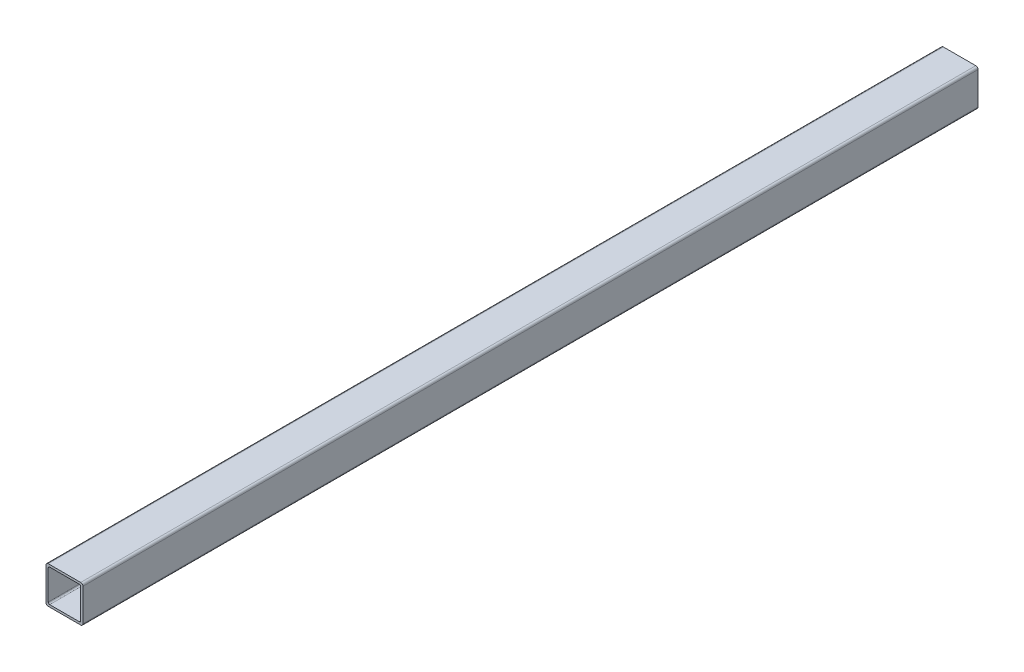
ISO-10303-21;
HEADER;
FILE_DESCRIPTION(('STEP AP214'),'2;1');
FILE_NAME('part.step','',(''),(''),'','','');
FILE_SCHEMA(('AUTOMOTIVE_DESIGN { 1 0 10303 214 1 1 1 1 }'));
ENDSEC;
DATA;
#1=APPLICATION_CONTEXT('core data for automotive mechanical design processes');
#2=APPLICATION_PROTOCOL_DEFINITION('international standard','automotive_design',2000,#1);
#3=PRODUCT_CONTEXT('',#1,'mechanical');
#4=PRODUCT('Part','Part','',(#3));
#5=PRODUCT_RELATED_PRODUCT_CATEGORY('part','',(#4));
#6=PRODUCT_DEFINITION_FORMATION('','',#4);
#7=PRODUCT_DEFINITION_CONTEXT('part definition',#1,'design');
#8=PRODUCT_DEFINITION('design','',#6,#7);
#9=PRODUCT_DEFINITION_SHAPE('','',#8);
#10=(LENGTH_UNIT() NAMED_UNIT(*) SI_UNIT(.MILLI.,.METRE.));
#11=(NAMED_UNIT(*) PLANE_ANGLE_UNIT() SI_UNIT($,.RADIAN.));
#12=(NAMED_UNIT(*) SI_UNIT($,.STERADIAN.) SOLID_ANGLE_UNIT());
#13=UNCERTAINTY_MEASURE_WITH_UNIT(LENGTH_MEASURE(1.E-05),#10,'distance_accuracy_value','');
#14=(GEOMETRIC_REPRESENTATION_CONTEXT(3) GLOBAL_UNCERTAINTY_ASSIGNED_CONTEXT((#13)) GLOBAL_UNIT_ASSIGNED_CONTEXT((#10,
#11,#12)) REPRESENTATION_CONTEXT('',''));
#15=CARTESIAN_POINT('',(0.,0.,0.));
#16=DIRECTION('',(0.,0.,1.));
#17=DIRECTION('',(1.,0.,0.));
#18=AXIS2_PLACEMENT_3D('',#15,#16,#17);
#19=CARTESIAN_POINT('',(8.88178419700125E-13,93.9999999999973,2566.42135623731));
#20=DIRECTION('',(1.,0.,0.));
#21=DIRECTION('',(0.,0.,-1.));
#22=AXIS2_PLACEMENT_3D('',#19,#20,#21);
#23=PLANE('',#22);
#24=DIRECTION('',(0.,-1.,0.));
#25=VECTOR('',#24,1.);
#26=CARTESIAN_POINT('',(8.88178419700125E-13,93.9999999999973,2425.));
#27=LINE('',#26,#25);
#28=CARTESIAN_POINT('',(8.88178419700125E-13,93.9999999999973,2425.));
#29=VERTEX_POINT('',#28);
#30=CARTESIAN_POINT('',(8.88178419700125E-13,5.99999999999734,2425.));
#31=VERTEX_POINT('',#30);
#32=EDGE_CURVE('E305',#29,#31,#27,.T.);
#33=ORIENTED_EDGE('',*,*,#32,.F.);
#34=DIRECTION('',(0.,0.,-1.));
#35=VECTOR('',#34,1.);
#36=CARTESIAN_POINT('',(8.88178419700125E-13,93.9999999999973,2566.42135623731));
#37=LINE('',#36,#35);
#38=CARTESIAN_POINT('',(8.88178419700125E-13,93.9999999999973,0.));
#39=VERTEX_POINT('',#38);
#40=EDGE_CURVE('E49',#29,#39,#37,.T.);
#41=ORIENTED_EDGE('',*,*,#40,.T.);
#42=DIRECTION('',(0.,-1.,0.));
#43=VECTOR('',#42,1.);
#44=CARTESIAN_POINT('',(8.88178419700125E-13,93.9999999999973,0.));
#45=LINE('',#44,#43);
#46=CARTESIAN_POINT('',(8.88178419700125E-13,5.99999999999734,0.));
#47=VERTEX_POINT('',#46);
#48=EDGE_CURVE('E200',#39,#47,#45,.T.);
#49=ORIENTED_EDGE('',*,*,#48,.T.);
#50=DIRECTION('',(0.,0.,-1.));
#51=VECTOR('',#50,1.);
#52=CARTESIAN_POINT('',(8.88178419700125E-13,5.99999999999734,2566.42135623731));
#53=LINE('',#52,#51);
#54=EDGE_CURVE('E203',#31,#47,#53,.T.);
#55=ORIENTED_EDGE('',*,*,#54,.F.);
#56=EDGE_LOOP('',(#33,#41,#49,#55));
#57=FACE_BOUND('',#56,.T.);
#58=ADVANCED_FACE('F34',(#57),#23,.F.);
#59=CARTESIAN_POINT('',(6.00000000000112,93.9999999999973,2566.42135623731));
#60=DIRECTION('',(0.,0.,-1.));
#61=DIRECTION('',(-1.,0.,0.));
#62=AXIS2_PLACEMENT_3D('',#59,#60,#61);
#63=CYLINDRICAL_SURFACE('',#62,6.00000000000014);
#64=CARTESIAN_POINT('',(6.00000000000112,93.9999999999973,2425.));
#65=DIRECTION('',(0.,0.,1.));
#66=DIRECTION('',(1.,0.,0.));
#67=AXIS2_PLACEMENT_3D('',#64,#65,#66);
#68=CIRCLE('',#67,6.00000000000014);
#69=CARTESIAN_POINT('',(6.00000000000112,99.9999999999975,2425.));
#70=VERTEX_POINT('',#69);
#71=EDGE_CURVE('E241',#70,#29,#68,.T.);
#72=ORIENTED_EDGE('',*,*,#71,.F.);
#73=DIRECTION('',(0.,0.,-1.));
#74=VECTOR('',#73,1.);
#75=CARTESIAN_POINT('',(6.00000000000112,99.9999999999975,2566.42135623731));
#76=LINE('',#75,#74);
#77=CARTESIAN_POINT('',(6.00000000000112,99.9999999999975,0.));
#78=VERTEX_POINT('',#77);
#79=EDGE_CURVE('E206',#70,#78,#76,.T.);
#80=ORIENTED_EDGE('',*,*,#79,.T.);
#81=CARTESIAN_POINT('',(6.00000000000112,93.9999999999973,0.));
#82=DIRECTION('',(0.,0.,1.));
#83=DIRECTION('',(1.,0.,0.));
#84=AXIS2_PLACEMENT_3D('',#81,#82,#83);
#85=CIRCLE('',#84,6.00000000000014);
#86=EDGE_CURVE('E198',#78,#39,#85,.T.);
#87=ORIENTED_EDGE('',*,*,#86,.T.);
#88=ORIENTED_EDGE('',*,*,#40,.F.);
#89=EDGE_LOOP('',(#72,#80,#87,#88));
#90=FACE_BOUND('',#89,.T.);
#91=ADVANCED_FACE('F238',(#90),#63,.T.);
#92=CARTESIAN_POINT('',(6.00000000000112,99.9999999999974,2566.42135623731));
#93=DIRECTION('',(0.,-1.,0.));
#94=DIRECTION('',(0.,0.,-1.));
#95=AXIS2_PLACEMENT_3D('',#92,#93,#94);
#96=PLANE('',#95);
#97=DIRECTION('',(-1.,0.,0.));
#98=VECTOR('',#97,1.);
#99=CARTESIAN_POINT('',(6.00000000000112,99.9999999999974,2425.));
#100=LINE('',#99,#98);
#101=CARTESIAN_POINT('',(94.0000000000003,99.9999999999974,2425.));
#102=VERTEX_POINT('',#101);
#103=EDGE_CURVE('E246',#102,#70,#100,.T.);
#104=ORIENTED_EDGE('',*,*,#103,.F.);
#105=DIRECTION('',(0.,0.,-1.));
#106=VECTOR('',#105,1.);
#107=CARTESIAN_POINT('',(94.0000000000003,99.9999999999974,2566.42135623731));
#108=LINE('',#107,#106);
#109=CARTESIAN_POINT('',(94.0000000000003,99.9999999999974,0.));
#110=VERTEX_POINT('',#109);
#111=EDGE_CURVE('E208',#102,#110,#108,.T.);
#112=ORIENTED_EDGE('',*,*,#111,.T.);
#113=DIRECTION('',(-1.,0.,0.));
#114=VECTOR('',#113,1.);
#115=CARTESIAN_POINT('',(6.00000000000112,99.9999999999974,0.));
#116=LINE('',#115,#114);
#117=EDGE_CURVE('E195',#110,#78,#116,.T.);
#118=ORIENTED_EDGE('',*,*,#117,.T.);
#119=ORIENTED_EDGE('',*,*,#79,.F.);
#120=EDGE_LOOP('',(#104,#112,#118,#119));
#121=FACE_BOUND('',#120,.T.);
#122=ADVANCED_FACE('F244',(#121),#96,.F.);
#123=CARTESIAN_POINT('',(94.0000000000003,93.9999999999973,2566.42135623731));
#124=DIRECTION('',(0.,0.,-1.));
#125=DIRECTION('',(-1.,0.,0.));
#126=AXIS2_PLACEMENT_3D('',#123,#124,#125);
#127=CYLINDRICAL_SURFACE('',#126,6.00000000000014);
#128=CARTESIAN_POINT('',(94.0000000000003,93.9999999999973,2425.));
#129=DIRECTION('',(0.,0.,1.));
#130=DIRECTION('',(1.,0.,0.));
#131=AXIS2_PLACEMENT_3D('',#128,#129,#130);
#132=CIRCLE('',#131,6.00000000000014);
#133=CARTESIAN_POINT('',(100.,93.9999999999973,2425.));
#134=VERTEX_POINT('',#133);
#135=EDGE_CURVE('E309',#134,#102,#132,.T.);
#136=ORIENTED_EDGE('',*,*,#135,.F.);
#137=DIRECTION('',(0.,0.,-1.));
#138=VECTOR('',#137,1.);
#139=CARTESIAN_POINT('',(100.,93.9999999999973,2566.42135623731));
#140=LINE('',#139,#138);
#141=CARTESIAN_POINT('',(100.,93.9999999999973,0.));
#142=VERTEX_POINT('',#141);
#143=EDGE_CURVE('E210',#134,#142,#140,.T.);
#144=ORIENTED_EDGE('',*,*,#143,.T.);
#145=CARTESIAN_POINT('',(94.0000000000003,93.9999999999973,0.));
#146=DIRECTION('',(0.,0.,1.));
#147=DIRECTION('',(-1.,0.,0.));
#148=AXIS2_PLACEMENT_3D('',#145,#146,#147);
#149=CIRCLE('',#148,6.00000000000014);
#150=EDGE_CURVE('E192',#142,#110,#149,.T.);
#151=ORIENTED_EDGE('',*,*,#150,.T.);
#152=ORIENTED_EDGE('',*,*,#111,.F.);
#153=EDGE_LOOP('',(#136,#144,#151,#152));
#154=FACE_BOUND('',#153,.T.);
#155=ADVANCED_FACE('F249',(#154),#127,.T.);
#156=CARTESIAN_POINT('',(100.000000000001,93.9999999999973,2566.42135623731));
#157=DIRECTION('',(-1.,0.,0.));
#158=DIRECTION('',(0.,0.,1.));
#159=AXIS2_PLACEMENT_3D('',#156,#157,#158);
#160=PLANE('',#159);
#161=DIRECTION('',(0.,1.,0.));
#162=VECTOR('',#161,1.);
#163=CARTESIAN_POINT('',(100.000000000001,93.9999999999973,2425.));
#164=LINE('',#163,#162);
#165=CARTESIAN_POINT('',(100.000000000001,5.99999999999734,2425.));
#166=VERTEX_POINT('',#165);
#167=EDGE_CURVE('E255',#166,#134,#164,.T.);
#168=ORIENTED_EDGE('',*,*,#167,.F.);
#169=DIRECTION('',(0.,0.,-1.));
#170=VECTOR('',#169,1.);
#171=CARTESIAN_POINT('',(100.000000000001,5.99999999999734,2566.42135623731));
#172=LINE('',#171,#170);
#173=CARTESIAN_POINT('',(100.000000000001,5.99999999999734,0.));
#174=VERTEX_POINT('',#173);
#175=EDGE_CURVE('E212',#166,#174,#172,.T.);
#176=ORIENTED_EDGE('',*,*,#175,.T.);
#177=DIRECTION('',(0.,1.,0.));
#178=VECTOR('',#177,1.);
#179=CARTESIAN_POINT('',(100.000000000001,93.9999999999973,0.));
#180=LINE('',#179,#178);
#181=EDGE_CURVE('E189',#174,#142,#180,.T.);
#182=ORIENTED_EDGE('',*,*,#181,.T.);
#183=ORIENTED_EDGE('',*,*,#143,.F.);
#184=EDGE_LOOP('',(#168,#176,#182,#183));
#185=FACE_BOUND('',#184,.T.);
#186=ADVANCED_FACE('F252',(#185),#160,.F.);
#187=CARTESIAN_POINT('',(94.0000000000003,5.99999999999734,2566.42135623731));
#188=DIRECTION('',(0.,0.,-1.));
#189=DIRECTION('',(-1.,0.,0.));
#190=AXIS2_PLACEMENT_3D('',#187,#188,#189);
#191=CYLINDRICAL_SURFACE('',#190,6.00000000000014);
#192=CARTESIAN_POINT('',(94.0000000000003,5.99999999999734,2425.));
#193=DIRECTION('',(0.,0.,1.));
#194=DIRECTION('',(1.,0.,0.));
#195=AXIS2_PLACEMENT_3D('',#192,#193,#194);
#196=CIRCLE('',#195,6.00000000000014);
#197=CARTESIAN_POINT('',(94.0000000000003,-2.80331313717852E-12,2425.));
#198=VERTEX_POINT('',#197);
#199=EDGE_CURVE('E259',#198,#166,#196,.T.);
#200=ORIENTED_EDGE('',*,*,#199,.F.);
#201=DIRECTION('',(0.,0.,-1.));
#202=VECTOR('',#201,1.);
#203=CARTESIAN_POINT('',(94.0000000000003,-2.80331313717852E-12,2566.42135623731));
#204=LINE('',#203,#202);
#205=CARTESIAN_POINT('',(94.0000000000003,-2.80331313717852E-12,0.));
#206=VERTEX_POINT('',#205);
#207=EDGE_CURVE('E214',#198,#206,#204,.T.);
#208=ORIENTED_EDGE('',*,*,#207,.T.);
#209=CARTESIAN_POINT('',(94.0000000000003,5.99999999999734,0.));
#210=DIRECTION('',(0.,0.,1.));
#211=DIRECTION('',(1.,0.,0.));
#212=AXIS2_PLACEMENT_3D('',#209,#210,#211);
#213=CIRCLE('',#212,6.00000000000014);
#214=EDGE_CURVE('E186',#206,#174,#213,.T.);
#215=ORIENTED_EDGE('',*,*,#214,.T.);
#216=ORIENTED_EDGE('',*,*,#175,.F.);
#217=EDGE_LOOP('',(#200,#208,#215,#216));
#218=FACE_BOUND('',#217,.T.);
#219=ADVANCED_FACE('F258',(#218),#191,.T.);
#220=CARTESIAN_POINT('',(6.00000000000112,-2.72004641033163E-12,2566.42135623731));
#221=DIRECTION('',(0.,1.,0.));
#222=DIRECTION('',(0.,0.,1.));
#223=AXIS2_PLACEMENT_3D('',#220,#221,#222);
#224=PLANE('',#223);
#225=DIRECTION('',(1.,0.,0.));
#226=VECTOR('',#225,1.);
#227=CARTESIAN_POINT('',(6.00000000000112,-2.72004641033163E-12,2425.));
#228=LINE('',#227,#226);
#229=CARTESIAN_POINT('',(6.00000000000112,-2.72004641033163E-12,2425.));
#230=VERTEX_POINT('',#229);
#231=EDGE_CURVE('E222',#230,#198,#228,.T.);
#232=ORIENTED_EDGE('',*,*,#231,.F.);
#233=DIRECTION('',(0.,0.,-1.));
#234=VECTOR('',#233,1.);
#235=CARTESIAN_POINT('',(6.00000000000112,-2.72004641033163E-12,2566.42135623731));
#236=LINE('',#235,#234);
#237=CARTESIAN_POINT('',(6.00000000000112,-2.72004641033163E-12,0.));
#238=VERTEX_POINT('',#237);
#239=EDGE_CURVE('E42',#230,#238,#236,.T.);
#240=ORIENTED_EDGE('',*,*,#239,.T.);
#241=DIRECTION('',(1.,0.,0.));
#242=VECTOR('',#241,1.);
#243=CARTESIAN_POINT('',(6.00000000000112,-2.72004641033163E-12,0.));
#244=LINE('',#243,#242);
#245=EDGE_CURVE('E183',#238,#206,#244,.T.);
#246=ORIENTED_EDGE('',*,*,#245,.T.);
#247=ORIENTED_EDGE('',*,*,#207,.F.);
#248=EDGE_LOOP('',(#232,#240,#246,#247));
#249=FACE_BOUND('',#248,.T.);
#250=ADVANCED_FACE('F218',(#249),#224,.F.);
#251=CARTESIAN_POINT('',(6.00000000000112,5.99999999999734,2566.42135623731));
#252=DIRECTION('',(0.,0.,-1.));
#253=DIRECTION('',(-1.,0.,0.));
#254=AXIS2_PLACEMENT_3D('',#251,#252,#253);
#255=CYLINDRICAL_SURFACE('',#254,6.00000000000014);
#256=CARTESIAN_POINT('',(6.00000000000112,5.99999999999734,2425.));
#257=DIRECTION('',(0.,0.,1.));
#258=DIRECTION('',(1.,0.,0.));
#259=AXIS2_PLACEMENT_3D('',#256,#257,#258);
#260=CIRCLE('',#259,6.00000000000014);
#261=EDGE_CURVE('E232',#31,#230,#260,.T.);
#262=ORIENTED_EDGE('',*,*,#261,.F.);
#263=ORIENTED_EDGE('',*,*,#54,.T.);
#264=CARTESIAN_POINT('',(6.00000000000112,5.99999999999734,0.));
#265=DIRECTION('',(0.,0.,1.));
#266=DIRECTION('',(1.,0.,0.));
#267=AXIS2_PLACEMENT_3D('',#264,#265,#266);
#268=CIRCLE('',#267,6.00000000000014);
#269=EDGE_CURVE('E180',#47,#238,#268,.T.);
#270=ORIENTED_EDGE('',*,*,#269,.T.);
#271=ORIENTED_EDGE('',*,*,#239,.F.);
#272=EDGE_LOOP('',(#262,#263,#270,#271));
#273=FACE_BOUND('',#272,.T.);
#274=ADVANCED_FACE('F36',(#273),#255,.T.);
#275=CARTESIAN_POINT('',(6.00000000000112,5.99999999999734,0.));
#276=DIRECTION('',(0.,0.,1.));
#277=DIRECTION('',(1.,0.,0.));
#278=AXIS2_PLACEMENT_3D('',#275,#276,#277);
#279=PLANE('',#278);
#280=ORIENTED_EDGE('',*,*,#269,.F.);
#281=ORIENTED_EDGE('',*,*,#48,.F.);
#282=ORIENTED_EDGE('',*,*,#86,.F.);
#283=ORIENTED_EDGE('',*,*,#117,.F.);
#284=ORIENTED_EDGE('',*,*,#150,.F.);
#285=ORIENTED_EDGE('',*,*,#181,.F.);
#286=ORIENTED_EDGE('',*,*,#214,.F.);
#287=ORIENTED_EDGE('',*,*,#245,.F.);
#288=EDGE_LOOP('',(#280,#281,#282,#283,#284,#285,#286,#287));
#289=FACE_BOUND('',#288,.T.);
#290=CARTESIAN_POINT('',(9.99999999999979,9.99999999999734,0.));
#291=DIRECTION('',(0.,0.,1.));
#292=DIRECTION('',(1.,0.,0.));
#293=AXIS2_PLACEMENT_3D('',#290,#291,#292);
#294=CIRCLE('',#293,3.99999999999978);
#295=CARTESIAN_POINT('',(6.00000000000023,9.99999999999734,0.));
#296=VERTEX_POINT('',#295);
#297=CARTESIAN_POINT('',(9.99999999999979,5.99999999999734,0.));
#298=VERTEX_POINT('',#297);
#299=EDGE_CURVE('E261',#296,#298,#294,.T.);
#300=ORIENTED_EDGE('',*,*,#299,.T.);
#301=DIRECTION('',(1.,0.,0.));
#302=VECTOR('',#301,1.);
#303=CARTESIAN_POINT('',(9.99999999999979,5.99999999999734,0.));
#304=LINE('',#303,#302);
#305=CARTESIAN_POINT('',(90.0000000000016,5.99999999999756,0.));
#306=VERTEX_POINT('',#305);
#307=EDGE_CURVE('E268',#298,#306,#304,.T.);
#308=ORIENTED_EDGE('',*,*,#307,.T.);
#309=CARTESIAN_POINT('',(90.0000000000016,9.99999999999734,0.));
#310=DIRECTION('',(0.,0.,1.));
#311=DIRECTION('',(1.,0.,0.));
#312=AXIS2_PLACEMENT_3D('',#309,#310,#311);
#313=CIRCLE('',#312,3.99999999999978);
#314=CARTESIAN_POINT('',(94.0000000000012,9.99999999999734,0.));
#315=VERTEX_POINT('',#314);
#316=EDGE_CURVE('E271',#306,#315,#313,.T.);
#317=ORIENTED_EDGE('',*,*,#316,.T.);
#318=DIRECTION('',(0.,1.,0.));
#319=VECTOR('',#318,1.);
#320=CARTESIAN_POINT('',(94.0000000000012,89.9999999999973,0.));
#321=LINE('',#320,#319);
#322=CARTESIAN_POINT('',(94.0000000000014,89.9999999999973,0.));
#323=VERTEX_POINT('',#322);
#324=EDGE_CURVE('E274',#315,#323,#321,.T.);
#325=ORIENTED_EDGE('',*,*,#324,.T.);
#326=CARTESIAN_POINT('',(90.0000000000016,89.9999999999973,0.));
#327=DIRECTION('',(0.,0.,1.));
#328=DIRECTION('',(-1.,0.,0.));
#329=AXIS2_PLACEMENT_3D('',#326,#327,#328);
#330=CIRCLE('',#329,3.99999999999978);
#331=CARTESIAN_POINT('',(90.0000000000016,93.9999999999973,0.));
#332=VERTEX_POINT('',#331);
#333=EDGE_CURVE('E277',#323,#332,#330,.T.);
#334=ORIENTED_EDGE('',*,*,#333,.T.);
#335=DIRECTION('',(-1.,0.,0.));
#336=VECTOR('',#335,1.);
#337=CARTESIAN_POINT('',(9.99999999999979,93.9999999999973,0.));
#338=LINE('',#337,#336);
#339=CARTESIAN_POINT('',(9.99999999999979,93.9999999999971,0.));
#340=VERTEX_POINT('',#339);
#341=EDGE_CURVE('E280',#332,#340,#338,.T.);
#342=ORIENTED_EDGE('',*,*,#341,.T.);
#343=CARTESIAN_POINT('',(9.99999999999979,89.9999999999973,0.));
#344=DIRECTION('',(0.,0.,1.));
#345=DIRECTION('',(1.,0.,0.));
#346=AXIS2_PLACEMENT_3D('',#343,#344,#345);
#347=CIRCLE('',#346,3.99999999999978);
#348=CARTESIAN_POINT('',(6.00000000000023,89.9999999999973,0.));
#349=VERTEX_POINT('',#348);
#350=EDGE_CURVE('E283',#340,#349,#347,.T.);
#351=ORIENTED_EDGE('',*,*,#350,.T.);
#352=DIRECTION('',(0.,-1.,0.));
#353=VECTOR('',#352,1.);
#354=CARTESIAN_POINT('',(6.00000000000023,89.9999999999973,0.));
#355=LINE('',#354,#353);
#356=EDGE_CURVE('E162',#349,#296,#355,.T.);
#357=ORIENTED_EDGE('',*,*,#356,.T.);
#358=EDGE_LOOP('',(#300,#308,#317,#325,#334,#342,#351,#357));
#359=FACE_BOUND('',#358,.T.);
#360=ADVANCED_FACE('F228',(#289,#359),#279,.F.);
#361=CARTESIAN_POINT('',(6.00000000000023,89.9999999999973,2566.42135623731));
#362=DIRECTION('',(1.,0.,0.));
#363=DIRECTION('',(0.,0.,-1.));
#364=AXIS2_PLACEMENT_3D('',#361,#362,#363);
#365=PLANE('',#364);
#366=DIRECTION('',(0.,0.,-1.));
#367=VECTOR('',#366,1.);
#368=CARTESIAN_POINT('',(6.00000000000023,89.9999999999973,2566.42135623731));
#369=LINE('',#368,#367);
#370=CARTESIAN_POINT('',(6.00000000000023,89.9999999999973,2425.));
#371=VERTEX_POINT('',#370);
#372=EDGE_CURVE('E154',#371,#349,#369,.T.);
#373=ORIENTED_EDGE('',*,*,#372,.F.);
#374=DIRECTION('',(0.,-1.,0.));
#375=VECTOR('',#374,1.);
#376=CARTESIAN_POINT('',(6.00000000000023,89.9999999999973,2425.));
#377=LINE('',#376,#375);
#378=CARTESIAN_POINT('',(6.00000000000023,9.99999999999734,2425.));
#379=VERTEX_POINT('',#378);
#380=EDGE_CURVE('E11',#371,#379,#377,.T.);
#381=ORIENTED_EDGE('',*,*,#380,.T.);
#382=DIRECTION('',(0.,0.,-1.));
#383=VECTOR('',#382,1.);
#384=CARTESIAN_POINT('',(6.00000000000023,9.99999999999734,2566.42135623731));
#385=LINE('',#384,#383);
#386=EDGE_CURVE('E164',#379,#296,#385,.T.);
#387=ORIENTED_EDGE('',*,*,#386,.T.);
#388=ORIENTED_EDGE('',*,*,#356,.F.);
#389=EDGE_LOOP('',(#373,#381,#387,#388));
#390=FACE_BOUND('',#389,.T.);
#391=ADVANCED_FACE('F160',(#390),#365,.T.);
#392=CARTESIAN_POINT('',(9.99999999999979,89.9999999999973,2566.42135623731));
#393=DIRECTION('',(0.,0.,-1.));
#394=DIRECTION('',(-1.,0.,0.));
#395=AXIS2_PLACEMENT_3D('',#392,#393,#394);
#396=CYLINDRICAL_SURFACE('',#395,3.99999999999978);
#397=DIRECTION('',(0.,0.,-1.));
#398=VECTOR('',#397,1.);
#399=CARTESIAN_POINT('',(9.99999999999979,93.9999999999971,2566.42135623731));
#400=LINE('',#399,#398);
#401=CARTESIAN_POINT('',(9.99999999999979,93.9999999999971,2425.));
#402=VERTEX_POINT('',#401);
#403=EDGE_CURVE('E156',#402,#340,#400,.T.);
#404=ORIENTED_EDGE('',*,*,#403,.F.);
#405=CARTESIAN_POINT('',(9.99999999999979,89.9999999999973,2425.));
#406=DIRECTION('',(0.,0.,1.));
#407=DIRECTION('',(1.,0.,0.));
#408=AXIS2_PLACEMENT_3D('',#405,#406,#407);
#409=CIRCLE('',#408,3.99999999999978);
#410=EDGE_CURVE('E147',#402,#371,#409,.T.);
#411=ORIENTED_EDGE('',*,*,#410,.T.);
#412=ORIENTED_EDGE('',*,*,#372,.T.);
#413=ORIENTED_EDGE('',*,*,#350,.F.);
#414=EDGE_LOOP('',(#404,#411,#412,#413));
#415=FACE_BOUND('',#414,.T.);
#416=ADVANCED_FACE('F152',(#415),#396,.F.);
#417=CARTESIAN_POINT('',(9.99999999999979,93.9999999999973,2566.42135623731));
#418=DIRECTION('',(0.,-1.,0.));
#419=DIRECTION('',(0.,0.,-1.));
#420=AXIS2_PLACEMENT_3D('',#417,#418,#419);
#421=PLANE('',#420);
#422=DIRECTION('',(0.,0.,-1.));
#423=VECTOR('',#422,1.);
#424=CARTESIAN_POINT('',(90.0000000000016,93.9999999999973,2566.42135623731));
#425=LINE('',#424,#423);
#426=CARTESIAN_POINT('',(90.0000000000016,93.9999999999973,2425.));
#427=VERTEX_POINT('',#426);
#428=EDGE_CURVE('E166',#427,#332,#425,.T.);
#429=ORIENTED_EDGE('',*,*,#428,.F.);
#430=DIRECTION('',(-1.,0.,0.));
#431=VECTOR('',#430,1.);
#432=CARTESIAN_POINT('',(9.99999999999979,93.9999999999973,2425.));
#433=LINE('',#432,#431);
#434=EDGE_CURVE('E158',#427,#402,#433,.T.);
#435=ORIENTED_EDGE('',*,*,#434,.T.);
#436=ORIENTED_EDGE('',*,*,#403,.T.);
#437=ORIENTED_EDGE('',*,*,#341,.F.);
#438=EDGE_LOOP('',(#429,#435,#436,#437));
#439=FACE_BOUND('',#438,.T.);
#440=ADVANCED_FACE('F289',(#439),#421,.T.);
#441=CARTESIAN_POINT('',(90.0000000000016,89.9999999999973,2566.42135623731));
#442=DIRECTION('',(0.,0.,-1.));
#443=DIRECTION('',(-1.,0.,0.));
#444=AXIS2_PLACEMENT_3D('',#441,#442,#443);
#445=CYLINDRICAL_SURFACE('',#444,3.99999999999978);
#446=DIRECTION('',(0.,0.,-1.));
#447=VECTOR('',#446,1.);
#448=CARTESIAN_POINT('',(94.0000000000014,89.9999999999973,2566.42135623731));
#449=LINE('',#448,#447);
#450=CARTESIAN_POINT('',(94.0000000000014,89.9999999999973,2425.));
#451=VERTEX_POINT('',#450);
#452=EDGE_CURVE('E172',#451,#323,#449,.T.);
#453=ORIENTED_EDGE('',*,*,#452,.F.);
#454=CARTESIAN_POINT('',(90.0000000000016,89.9999999999973,2425.));
#455=DIRECTION('',(0.,0.,1.));
#456=DIRECTION('',(1.,0.,0.));
#457=AXIS2_PLACEMENT_3D('',#454,#455,#456);
#458=CIRCLE('',#457,3.99999999999978);
#459=EDGE_CURVE('E291',#451,#427,#458,.T.);
#460=ORIENTED_EDGE('',*,*,#459,.T.);
#461=ORIENTED_EDGE('',*,*,#428,.T.);
#462=ORIENTED_EDGE('',*,*,#333,.F.);
#463=EDGE_LOOP('',(#453,#460,#461,#462));
#464=FACE_BOUND('',#463,.T.);
#465=ADVANCED_FACE('F326',(#464),#445,.F.);
#466=CARTESIAN_POINT('',(94.0000000000012,89.9999999999973,2566.42135623731));
#467=DIRECTION('',(-1.,0.,0.));
#468=DIRECTION('',(0.,0.,1.));
#469=AXIS2_PLACEMENT_3D('',#466,#467,#468);
#470=PLANE('',#469);
#471=DIRECTION('',(0.,0.,-1.));
#472=VECTOR('',#471,1.);
#473=CARTESIAN_POINT('',(94.0000000000012,9.99999999999734,2566.42135623731));
#474=LINE('',#473,#472);
#475=CARTESIAN_POINT('',(94.0000000000012,9.99999999999734,2425.));
#476=VERTEX_POINT('',#475);
#477=EDGE_CURVE('E174',#476,#315,#474,.T.);
#478=ORIENTED_EDGE('',*,*,#477,.F.);
#479=DIRECTION('',(0.,1.,0.));
#480=VECTOR('',#479,1.);
#481=CARTESIAN_POINT('',(94.0000000000012,89.9999999999973,2425.));
#482=LINE('',#481,#480);
#483=EDGE_CURVE('E293',#476,#451,#482,.T.);
#484=ORIENTED_EDGE('',*,*,#483,.T.);
#485=ORIENTED_EDGE('',*,*,#452,.T.);
#486=ORIENTED_EDGE('',*,*,#324,.F.);
#487=EDGE_LOOP('',(#478,#484,#485,#486));
#488=FACE_BOUND('',#487,.T.);
#489=ADVANCED_FACE('F323',(#488),#470,.T.);
#490=CARTESIAN_POINT('',(90.0000000000016,9.99999999999734,2566.42135623731));
#491=DIRECTION('',(0.,0.,-1.));
#492=DIRECTION('',(-1.,0.,0.));
#493=AXIS2_PLACEMENT_3D('',#490,#491,#492);
#494=CYLINDRICAL_SURFACE('',#493,3.99999999999978);
#495=DIRECTION('',(0.,0.,-1.));
#496=VECTOR('',#495,1.);
#497=CARTESIAN_POINT('',(90.0000000000016,5.99999999999756,2566.42135623731));
#498=LINE('',#497,#496);
#499=CARTESIAN_POINT('',(90.0000000000016,5.99999999999756,2425.));
#500=VERTEX_POINT('',#499);
#501=EDGE_CURVE('E176',#500,#306,#498,.T.);
#502=ORIENTED_EDGE('',*,*,#501,.F.);
#503=CARTESIAN_POINT('',(90.0000000000016,9.99999999999734,2425.));
#504=DIRECTION('',(0.,0.,1.));
#505=DIRECTION('',(1.,0.,0.));
#506=AXIS2_PLACEMENT_3D('',#503,#504,#505);
#507=CIRCLE('',#506,3.99999999999978);
#508=EDGE_CURVE('E298',#500,#476,#507,.T.);
#509=ORIENTED_EDGE('',*,*,#508,.T.);
#510=ORIENTED_EDGE('',*,*,#477,.T.);
#511=ORIENTED_EDGE('',*,*,#316,.F.);
#512=EDGE_LOOP('',(#502,#509,#510,#511));
#513=FACE_BOUND('',#512,.T.);
#514=ADVANCED_FACE('F320',(#513),#494,.F.);
#515=CARTESIAN_POINT('',(9.99999999999979,5.99999999999734,2566.42135623731));
#516=DIRECTION('',(0.,1.,0.));
#517=DIRECTION('',(0.,0.,1.));
#518=AXIS2_PLACEMENT_3D('',#515,#516,#517);
#519=PLANE('',#518);
#520=DIRECTION('',(0.,0.,-1.));
#521=VECTOR('',#520,1.);
#522=CARTESIAN_POINT('',(9.99999999999979,5.99999999999734,2566.42135623731));
#523=LINE('',#522,#521);
#524=CARTESIAN_POINT('',(9.99999999999979,5.99999999999734,2425.));
#525=VERTEX_POINT('',#524);
#526=EDGE_CURVE('E178',#525,#298,#523,.T.);
#527=ORIENTED_EDGE('',*,*,#526,.F.);
#528=DIRECTION('',(1.,0.,0.));
#529=VECTOR('',#528,1.);
#530=CARTESIAN_POINT('',(9.99999999999979,5.99999999999734,2425.));
#531=LINE('',#530,#529);
#532=EDGE_CURVE('E301',#525,#500,#531,.T.);
#533=ORIENTED_EDGE('',*,*,#532,.T.);
#534=ORIENTED_EDGE('',*,*,#501,.T.);
#535=ORIENTED_EDGE('',*,*,#307,.F.);
#536=EDGE_LOOP('',(#527,#533,#534,#535));
#537=FACE_BOUND('',#536,.T.);
#538=ADVANCED_FACE('F315',(#537),#519,.T.);
#539=CARTESIAN_POINT('',(9.99999999999979,9.99999999999734,2566.42135623731));
#540=DIRECTION('',(0.,0.,-1.));
#541=DIRECTION('',(-1.,0.,0.));
#542=AXIS2_PLACEMENT_3D('',#539,#540,#541);
#543=CYLINDRICAL_SURFACE('',#542,3.99999999999978);
#544=ORIENTED_EDGE('',*,*,#386,.F.);
#545=CARTESIAN_POINT('',(9.99999999999979,9.99999999999734,2425.));
#546=DIRECTION('',(0.,0.,1.));
#547=DIRECTION('',(1.,0.,0.));
#548=AXIS2_PLACEMENT_3D('',#545,#546,#547);
#549=CIRCLE('',#548,3.99999999999978);
#550=EDGE_CURVE('E57',#379,#525,#549,.T.);
#551=ORIENTED_EDGE('',*,*,#550,.T.);
#552=ORIENTED_EDGE('',*,*,#526,.T.);
#553=ORIENTED_EDGE('',*,*,#299,.F.);
#554=EDGE_LOOP('',(#544,#551,#552,#553));
#555=FACE_BOUND('',#554,.T.);
#556=ADVANCED_FACE('F311',(#555),#543,.F.);
#557=CARTESIAN_POINT('',(6.00000000000006,2601.42135623731,2425.));
#558=DIRECTION('',(0.,0.,1.));
#559=DIRECTION('',(1.,0.,0.));
#560=AXIS2_PLACEMENT_3D('',#557,#558,#559);
#561=PLANE('',#560);
#562=ORIENTED_EDGE('',*,*,#550,.F.);
#563=ORIENTED_EDGE('',*,*,#380,.F.);
#564=ORIENTED_EDGE('',*,*,#410,.F.);
#565=ORIENTED_EDGE('',*,*,#434,.F.);
#566=ORIENTED_EDGE('',*,*,#459,.F.);
#567=ORIENTED_EDGE('',*,*,#483,.F.);
#568=ORIENTED_EDGE('',*,*,#508,.F.);
#569=ORIENTED_EDGE('',*,*,#532,.F.);
#570=EDGE_LOOP('',(#562,#563,#564,#565,#566,#567,#568,#569));
#571=FACE_BOUND('',#570,.T.);
#572=ORIENTED_EDGE('',*,*,#32,.T.);
#573=ORIENTED_EDGE('',*,*,#261,.T.);
#574=ORIENTED_EDGE('',*,*,#231,.T.);
#575=ORIENTED_EDGE('',*,*,#199,.T.);
#576=ORIENTED_EDGE('',*,*,#167,.T.);
#577=ORIENTED_EDGE('',*,*,#135,.T.);
#578=ORIENTED_EDGE('',*,*,#103,.T.);
#579=ORIENTED_EDGE('',*,*,#71,.T.);
#580=EDGE_LOOP('',(#572,#573,#574,#575,#576,#577,#578,#579));
#581=FACE_BOUND('',#580,.T.);
#582=ADVANCED_FACE('F145',(#571,#581),#561,.T.);
#583=CLOSED_SHELL('',(#58,#91,#122,#155,#186,#219,#250,#274,#360,#391,#416,#440,#465,#489,#514,
#538,#556,#582));
#584=MANIFOLD_SOLID_BREP('B2',#583);
#585=ADVANCED_BREP_SHAPE_REPRESENTATION('',(#18,#584),#14);
#586=SHAPE_DEFINITION_REPRESENTATION(#9,#585);
ENDSEC;
END-ISO-10303-21;
